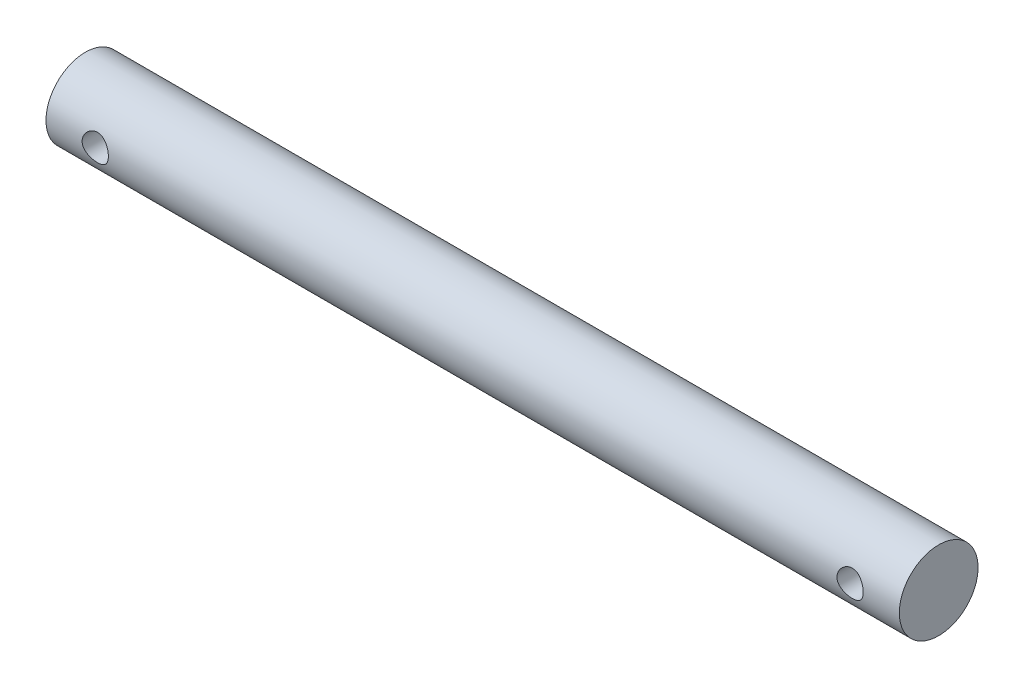
ISO-10303-21;
HEADER;
FILE_DESCRIPTION(('STEP AP214'),'2;1');
FILE_NAME('part.step','',(''),(''),'','','');
FILE_SCHEMA(('AUTOMOTIVE_DESIGN { 1 0 10303 214 1 1 1 1 }'));
ENDSEC;
DATA;
#1=APPLICATION_CONTEXT('core data for automotive mechanical design processes');
#2=APPLICATION_PROTOCOL_DEFINITION('international standard','automotive_design',2000,#1);
#3=PRODUCT_CONTEXT('',#1,'mechanical');
#4=PRODUCT('Part','Part','',(#3));
#5=PRODUCT_RELATED_PRODUCT_CATEGORY('part','',(#4));
#6=PRODUCT_DEFINITION_FORMATION('','',#4);
#7=PRODUCT_DEFINITION_CONTEXT('part definition',#1,'design');
#8=PRODUCT_DEFINITION('design','',#6,#7);
#9=PRODUCT_DEFINITION_SHAPE('','',#8);
#10=(LENGTH_UNIT() NAMED_UNIT(*) SI_UNIT(.MILLI.,.METRE.));
#11=(NAMED_UNIT(*) PLANE_ANGLE_UNIT() SI_UNIT($,.RADIAN.));
#12=(NAMED_UNIT(*) SI_UNIT($,.STERADIAN.) SOLID_ANGLE_UNIT());
#13=UNCERTAINTY_MEASURE_WITH_UNIT(LENGTH_MEASURE(1.E-05),#10,'distance_accuracy_value','');
#14=(GEOMETRIC_REPRESENTATION_CONTEXT(3) GLOBAL_UNCERTAINTY_ASSIGNED_CONTEXT((#13)) GLOBAL_UNIT_ASSIGNED_CONTEXT((#10,
#11,#12)) REPRESENTATION_CONTEXT('',''));
#15=CARTESIAN_POINT('',(0.,0.,0.));
#16=DIRECTION('',(0.,0.,1.));
#17=DIRECTION('',(1.,0.,0.));
#18=AXIS2_PLACEMENT_3D('',#15,#16,#17);
#19=CARTESIAN_POINT('',(0.,0.,0.));
#20=DIRECTION('',(1.,0.,0.));
#21=DIRECTION('',(0.,0.,-1.));
#22=AXIS2_PLACEMENT_3D('',#19,#20,#21);
#23=PLANE('',#22);
#24=CARTESIAN_POINT('',(0.,0.,0.));
#25=DIRECTION('',(-1.,0.,0.));
#26=DIRECTION('',(0.,0.,1.));
#27=AXIS2_PLACEMENT_3D('',#24,#25,#26);
#28=CIRCLE('',#27,6.);
#29=CARTESIAN_POINT('',(0.,0.,6.));
#30=VERTEX_POINT('',#29);
#31=EDGE_CURVE('E77',#30,#30,#28,.T.);
#32=ORIENTED_EDGE('',*,*,#31,.T.);
#33=EDGE_LOOP('',(#32));
#34=FACE_BOUND('',#33,.T.);
#35=ADVANCED_FACE('F30',(#34),#23,.F.);
#36=CARTESIAN_POINT('',(0.,0.,0.));
#37=DIRECTION('',(-1.,0.,0.));
#38=DIRECTION('',(0.,0.,1.));
#39=AXIS2_PLACEMENT_3D('',#36,#37,#38);
#40=CYLINDRICAL_SURFACE('',#39,6.);
#41=CARTESIAN_POINT('',(124.5,0.,-6.));
#42=CARTESIAN_POINT('',(124.500000507463,0.109126725773446,-6.00000030601888));
#43=CARTESIAN_POINT('',(124.491039467746,0.218250389077099,-5.99699539015089));
#44=CARTESIAN_POINT('',(124.455541782366,0.433283521745943,-5.98530420406561));
#45=CARTESIAN_POINT('',(124.429003312102,0.539192656237633,-5.97661734404305));
#46=CARTESIAN_POINT('',(124.359361513232,0.744665579003548,-5.95450615812885));
#47=CARTESIAN_POINT('',(124.316285875081,0.844239651772064,-5.94108975461707));
#48=CARTESIAN_POINT('',(124.214917654323,1.03474987361064,-5.91088891434684));
#49=CARTESIAN_POINT('',(124.156622069995,1.12568431391741,-5.89410381335556));
#50=CARTESIAN_POINT('',(124.024348390282,1.29948335004453,-5.8582818888601));
#51=CARTESIAN_POINT('',(123.949937531479,1.38200740059661,-5.8391911292757));
#52=CARTESIAN_POINT('',(123.788465690587,1.53366538540416,-5.80120629566243));
#53=CARTESIAN_POINT('',(123.701401930143,1.60279637097892,-5.78231226581098));
#54=CARTESIAN_POINT('',(123.514029769607,1.72764988445572,-5.74626664954547));
#55=CARTESIAN_POINT('',(123.413412520536,1.78292971644206,-5.72918078551376));
#56=CARTESIAN_POINT('',(123.203647811083,1.87563774775544,-5.69950610837202));
#57=CARTESIAN_POINT('',(123.094502965675,1.91307139477353,-5.68691592321491));
#58=CARTESIAN_POINT('',(122.874653557007,1.96774692301832,-5.66822606538755));
#59=CARTESIAN_POINT('',(122.764125583022,1.98562689654354,-5.66192191539223));
#60=CARTESIAN_POINT('',(122.541472491688,2.00268224666895,-5.65591313259015));
#61=CARTESIAN_POINT('',(122.429347878582,2.00186340320943,-5.6562064604546));
#62=CARTESIAN_POINT('',(122.212126739112,1.98203980740683,-5.66318030016361));
#63=CARTESIAN_POINT('',(122.106943194162,1.96386782633398,-5.66956831735066));
#64=CARTESIAN_POINT('',(121.901213160786,1.91121232569883,-5.68753315449102));
#65=CARTESIAN_POINT('',(121.80066722913,1.87672685318374,-5.69911059568215));
#66=CARTESIAN_POINT('',(121.605174500817,1.79187811612042,-5.72635822262498));
#67=CARTESIAN_POINT('',(121.510343949061,1.74126809741452,-5.74209131586235));
#68=CARTESIAN_POINT('',(121.330258183441,1.62577821260627,-5.77585117151453));
#69=CARTESIAN_POINT('',(121.245005746133,1.56089422472801,-5.79387859580927));
#70=CARTESIAN_POINT('',(121.081816803678,1.41469866536447,-5.83134658335482));
#71=CARTESIAN_POINT('',(121.004494610982,1.33270630015262,-5.85081178709686));
#72=CARTESIAN_POINT('',(120.864537466673,1.15667913994013,-5.88813876774073));
#73=CARTESIAN_POINT('',(120.801903923671,1.06264319132163,-5.90600039076135));
#74=CARTESIAN_POINT('',(120.69260739953,0.863895226092534,-5.93834215875587));
#75=CARTESIAN_POINT('',(120.646109017319,0.759086552832672,-5.95278700016078));
#76=CARTESIAN_POINT('',(120.571593652089,0.542538166729012,-5.9764113428887));
#77=CARTESIAN_POINT('',(120.543570249153,0.430800876309905,-5.98559267309759));
#78=CARTESIAN_POINT('',(120.507888667955,0.208767659058606,-5.99735254142881));
#79=CARTESIAN_POINT('',(120.499400381655,0.0986191997296909,-6.00020003667456));
#80=CARTESIAN_POINT('',(120.500665347197,-0.121550139920476,-5.99977805389655));
#81=CARTESIAN_POINT('',(120.51041551996,-0.231571038639301,-5.99650960838725));
#82=CARTESIAN_POINT('',(120.547223815472,-0.445039732608511,-5.98440049434209));
#83=CARTESIAN_POINT('',(120.573772412099,-0.548585613669687,-5.97572397422385));
#84=CARTESIAN_POINT('',(120.642786888933,-0.749711917159147,-5.9538369366014));
#85=CARTESIAN_POINT('',(120.685254798936,-0.847291577017213,-5.9406258409335));
#86=CARTESIAN_POINT('',(120.786140863682,-1.03657659278655,-5.91057862574579));
#87=CARTESIAN_POINT('',(120.844949186566,-1.12805991843429,-5.89365629511572));
#88=CARTESIAN_POINT('',(120.976388300027,-1.30012966027117,-5.85810507832525));
#89=CARTESIAN_POINT('',(121.049023312064,-1.38071273559115,-5.83947567187655));
#90=CARTESIAN_POINT('',(121.209957502013,-1.5325050156126,-5.80153695960889));
#91=CARTESIAN_POINT('',(121.298818453854,-1.60312193849153,-5.78223522174856));
#92=CARTESIAN_POINT('',(121.487543135622,-1.72851504464714,-5.74599946589418));
#93=CARTESIAN_POINT('',(121.587406957268,-1.78329109586202,-5.72906546764005));
#94=CARTESIAN_POINT('',(121.79534603058,-1.87519386083272,-5.69964783582767));
#95=CARTESIAN_POINT('',(121.903404158338,-1.91235626433004,-5.68715521585958));
#96=CARTESIAN_POINT('',(122.124757300088,-1.96778933351871,-5.66821664612899));
#97=CARTESIAN_POINT('',(122.238049930809,-1.98606850990788,-5.66176797247279));
#98=CARTESIAN_POINT('',(122.460394192082,-2.00255256495468,-5.65595717748355));
#99=CARTESIAN_POINT('',(122.569364680574,-2.0017405146168,-5.6562480051483));
#100=CARTESIAN_POINT('',(122.785530149844,-1.98248458689738,-5.66302539647735));
#101=CARTESIAN_POINT('',(122.89272523591,-1.96404175891717,-5.66951159138723));
#102=CARTESIAN_POINT('',(123.100271326005,-1.91074362625869,-5.68769048609783));
#103=CARTESIAN_POINT('',(123.200713650009,-1.87620669203103,-5.69928196044955));
#104=CARTESIAN_POINT('',(123.394454813877,-1.79195873151949,-5.72632797636937));
#105=CARTESIAN_POINT('',(123.487752062376,-1.74224433710761,-5.74178337526786));
#106=CARTESIAN_POINT('',(123.668967339846,-1.62652138516685,-5.77565658452093));
#107=CARTESIAN_POINT('',(123.756473003797,-1.55989648552915,-5.79417423284274));
#108=CARTESIAN_POINT('',(123.919379626768,-1.41328576627129,-5.83166712566506));
#109=CARTESIAN_POINT('',(123.994777151376,-1.33329616890295,-5.85064249824745));
#110=CARTESIAN_POINT('',(124.134288824578,-1.15848311384137,-5.88780061051088));
#111=CARTESIAN_POINT('',(124.197848695502,-1.06320302699945,-5.90592363602513));
#112=CARTESIAN_POINT('',(124.307980857701,-0.862714714813246,-5.93851982345224));
#113=CARTESIAN_POINT('',(124.354557491844,-0.757509036264692,-5.9529939181586));
#114=CARTESIAN_POINT('',(124.427443264977,-0.544987294401945,-5.97611030137084));
#115=CARTESIAN_POINT('',(124.454564932527,-0.437975515352811,-5.98498424845045));
#116=CARTESIAN_POINT('',(124.490840561354,-0.22064083202049,-5.99692814128444));
#117=CARTESIAN_POINT('',(124.499999486993,-0.110318851137491,-5.9999996906381));
#118=CARTESIAN_POINT('',(124.5,0.,-6.));
#119=B_SPLINE_CURVE_WITH_KNOTS('',3,(#41,#42,#43,#44,#45,#46,#47,#48,#49,#50,#51,#52,#53,#54,
#55,#56,#57,#58,#59,#60,#61,#62,#63,#64,#65,#66,#67,#68,#69,#70,#71,#72,#73,#74,#75,#76,#77,#78,
#79,#80,#81,#82,#83,#84,#85,#86,#87,#88,#89,#90,#91,#92,#93,#94,#95,#96,#97,#98,#99,#100,#101,
#102,#103,#104,#105,#106,#107,#108,#109,#110,#111,#112,#113,#114,#115,#116,#117,#118),
.UNSPECIFIED.,.T.,.F.,(4,2,2,2,2,2,2,2,2,2,2,2,2,2,2,2,2,2,2,2,2,2,2,2,2,2,2,2,2,2,2,2,2,2,2,2,
2,2,4),(0.,0.326974212052021,0.653982370535041,0.980445345740539,1.30697275559819,
1.64369368565512,1.98048866575061,2.32696769646942,2.67334089385666,3.00803851483681,
3.34263267974972,3.66193653102562,3.98127861710962,4.30576342310261,4.63034205116415,
4.97186611622733,5.31342291933235,5.65836811300715,6.00319337754416,6.33307166350338,
6.66289426328352,6.98316315956426,7.30347290568206,7.63220799687472,7.96104361643781,
8.30482045761502,8.64860016469991,8.99168027653541,9.33460569411678,9.65991332128513,
9.98520158702748,10.3043117416083,10.6234927635195,10.9566013338361,11.2898042224756,
11.635993216702,11.9820936230491,12.3127311674763,12.6432773207628),.UNSPECIFIED.);
#120=CARTESIAN_POINT('',(124.5,0.,-6.));
#121=VERTEX_POINT('',#120);
#122=EDGE_CURVE('E10',#121,#121,#119,.T.);
#123=ORIENTED_EDGE('',*,*,#122,.T.);
#124=EDGE_LOOP('',(#123));
#125=FACE_BOUND('',#124,.T.);
#126=CARTESIAN_POINT('',(124.5,0.,6.));
#127=CARTESIAN_POINT('',(124.500000507463,-0.109126725773446,6.00000030601888));
#128=CARTESIAN_POINT('',(124.491039467746,-0.218250389077099,5.99699539015089));
#129=CARTESIAN_POINT('',(124.455541782366,-0.433283521745943,5.98530420406561));
#130=CARTESIAN_POINT('',(124.429003312102,-0.539192656237633,5.97661734404305));
#131=CARTESIAN_POINT('',(124.359361513232,-0.744665579003548,5.95450615812885));
#132=CARTESIAN_POINT('',(124.316285875081,-0.844239651772064,5.94108975461707));
#133=CARTESIAN_POINT('',(124.214917654323,-1.03474987361064,5.91088891434684));
#134=CARTESIAN_POINT('',(124.156622069995,-1.12568431391741,5.89410381335556));
#135=CARTESIAN_POINT('',(124.024348390282,-1.29948335004453,5.8582818888601));
#136=CARTESIAN_POINT('',(123.949937531479,-1.38200740059661,5.8391911292757));
#137=CARTESIAN_POINT('',(123.788465690587,-1.53366538540416,5.80120629566243));
#138=CARTESIAN_POINT('',(123.701401930143,-1.60279637097892,5.78231226581098));
#139=CARTESIAN_POINT('',(123.514029769607,-1.72764988445572,5.74626664954547));
#140=CARTESIAN_POINT('',(123.413412520536,-1.78292971644206,5.72918078551376));
#141=CARTESIAN_POINT('',(123.203647811083,-1.87563774775544,5.69950610837202));
#142=CARTESIAN_POINT('',(123.094502965675,-1.91307139477353,5.68691592321491));
#143=CARTESIAN_POINT('',(122.874653557007,-1.96774692301832,5.66822606538755));
#144=CARTESIAN_POINT('',(122.764125583022,-1.98562689654354,5.66192191539223));
#145=CARTESIAN_POINT('',(122.541472491688,-2.00268224666895,5.65591313259015));
#146=CARTESIAN_POINT('',(122.429347878582,-2.00186340320943,5.6562064604546));
#147=CARTESIAN_POINT('',(122.212126739112,-1.98203980740683,5.66318030016361));
#148=CARTESIAN_POINT('',(122.106943194162,-1.96386782633398,5.66956831735066));
#149=CARTESIAN_POINT('',(121.901213160786,-1.91121232569883,5.68753315449102));
#150=CARTESIAN_POINT('',(121.80066722913,-1.87672685318374,5.69911059568215));
#151=CARTESIAN_POINT('',(121.605174500817,-1.79187811612042,5.72635822262498));
#152=CARTESIAN_POINT('',(121.510343949061,-1.74126809741452,5.74209131586235));
#153=CARTESIAN_POINT('',(121.330258183441,-1.62577821260627,5.77585117151453));
#154=CARTESIAN_POINT('',(121.245005746133,-1.56089422472801,5.79387859580927));
#155=CARTESIAN_POINT('',(121.081816803678,-1.41469866536447,5.83134658335482));
#156=CARTESIAN_POINT('',(121.004494610982,-1.33270630015262,5.85081178709686));
#157=CARTESIAN_POINT('',(120.864537466673,-1.15667913994013,5.88813876774073));
#158=CARTESIAN_POINT('',(120.801903923671,-1.06264319132163,5.90600039076135));
#159=CARTESIAN_POINT('',(120.69260739953,-0.863895226092534,5.93834215875587));
#160=CARTESIAN_POINT('',(120.646109017319,-0.759086552832672,5.95278700016078));
#161=CARTESIAN_POINT('',(120.571593652089,-0.542538166729012,5.9764113428887));
#162=CARTESIAN_POINT('',(120.543570249153,-0.430800876309905,5.98559267309759));
#163=CARTESIAN_POINT('',(120.507888667955,-0.208767659058606,5.99735254142881));
#164=CARTESIAN_POINT('',(120.499400381655,-0.0986191997296909,6.00020003667456));
#165=CARTESIAN_POINT('',(120.500665347197,0.121550139920476,5.99977805389655));
#166=CARTESIAN_POINT('',(120.51041551996,0.231571038639301,5.99650960838725));
#167=CARTESIAN_POINT('',(120.547223815472,0.445039732608511,5.98440049434209));
#168=CARTESIAN_POINT('',(120.573772412099,0.548585613669687,5.97572397422385));
#169=CARTESIAN_POINT('',(120.642786888933,0.749711917159147,5.9538369366014));
#170=CARTESIAN_POINT('',(120.685254798936,0.847291577017213,5.9406258409335));
#171=CARTESIAN_POINT('',(120.786140863682,1.03657659278655,5.91057862574579));
#172=CARTESIAN_POINT('',(120.844949186566,1.12805991843429,5.89365629511572));
#173=CARTESIAN_POINT('',(120.976388300027,1.30012966027117,5.85810507832525));
#174=CARTESIAN_POINT('',(121.049023312064,1.38071273559115,5.83947567187655));
#175=CARTESIAN_POINT('',(121.209957502013,1.5325050156126,5.80153695960889));
#176=CARTESIAN_POINT('',(121.298818453854,1.60312193849153,5.78223522174856));
#177=CARTESIAN_POINT('',(121.487543135622,1.72851504464714,5.74599946589418));
#178=CARTESIAN_POINT('',(121.587406957268,1.78329109586202,5.72906546764005));
#179=CARTESIAN_POINT('',(121.79534603058,1.87519386083272,5.69964783582767));
#180=CARTESIAN_POINT('',(121.903404158338,1.91235626433004,5.68715521585958));
#181=CARTESIAN_POINT('',(122.124757300088,1.96778933351871,5.66821664612899));
#182=CARTESIAN_POINT('',(122.238049930809,1.98606850990788,5.66176797247279));
#183=CARTESIAN_POINT('',(122.460394192082,2.00255256495468,5.65595717748355));
#184=CARTESIAN_POINT('',(122.569364680574,2.0017405146168,5.6562480051483));
#185=CARTESIAN_POINT('',(122.785530149844,1.98248458689738,5.66302539647735));
#186=CARTESIAN_POINT('',(122.89272523591,1.96404175891717,5.66951159138723));
#187=CARTESIAN_POINT('',(123.100271326005,1.91074362625869,5.68769048609783));
#188=CARTESIAN_POINT('',(123.200713650009,1.87620669203103,5.69928196044955));
#189=CARTESIAN_POINT('',(123.394454813877,1.79195873151949,5.72632797636937));
#190=CARTESIAN_POINT('',(123.487752062376,1.74224433710761,5.74178337526786));
#191=CARTESIAN_POINT('',(123.668967339846,1.62652138516685,5.77565658452093));
#192=CARTESIAN_POINT('',(123.756473003797,1.55989648552915,5.79417423284274));
#193=CARTESIAN_POINT('',(123.919379626768,1.41328576627129,5.83166712566506));
#194=CARTESIAN_POINT('',(123.994777151376,1.33329616890295,5.85064249824745));
#195=CARTESIAN_POINT('',(124.134288824578,1.15848311384137,5.88780061051088));
#196=CARTESIAN_POINT('',(124.197848695502,1.06320302699945,5.90592363602513));
#197=CARTESIAN_POINT('',(124.307980857701,0.862714714813246,5.93851982345224));
#198=CARTESIAN_POINT('',(124.354557491844,0.757509036264692,5.9529939181586));
#199=CARTESIAN_POINT('',(124.427443264977,0.544987294401945,5.97611030137084));
#200=CARTESIAN_POINT('',(124.454564932527,0.437975515352811,5.98498424845045));
#201=CARTESIAN_POINT('',(124.490840561354,0.22064083202049,5.99692814128444));
#202=CARTESIAN_POINT('',(124.499999486993,0.110318851137491,5.9999996906381));
#203=CARTESIAN_POINT('',(124.5,0.,6.));
#204=B_SPLINE_CURVE_WITH_KNOTS('',3,(#126,#127,#128,#129,#130,#131,#132,#133,#134,#135,#136,
#137,#138,#139,#140,#141,#142,#143,#144,#145,#146,#147,#148,#149,#150,#151,#152,#153,#154,#155,
#156,#157,#158,#159,#160,#161,#162,#163,#164,#165,#166,#167,#168,#169,#170,#171,#172,#173,#174,
#175,#176,#177,#178,#179,#180,#181,#182,#183,#184,#185,#186,#187,#188,#189,#190,#191,#192,#193,
#194,#195,#196,#197,#198,#199,#200,#201,#202,#203),.UNSPECIFIED.,.T.,.F.,(4,2,2,2,2,2,2,2,2,2,2,
2,2,2,2,2,2,2,2,2,2,2,2,2,2,2,2,2,2,2,2,2,2,2,2,2,2,2,4),(0.,0.326974212052021,
0.653982370535041,0.980445345740539,1.30697275559819,1.64369368565512,1.98048866575061,
2.32696769646942,2.67334089385666,3.00803851483681,3.34263267974972,3.66193653102562,
3.98127861710962,4.30576342310261,4.63034205116415,4.97186611622733,5.31342291933235,
5.65836811300715,6.00319337754416,6.33307166350338,6.66289426328352,6.98316315956426,
7.30347290568206,7.63220799687472,7.96104361643781,8.30482045761502,8.64860016469991,
8.99168027653541,9.33460569411678,9.65991332128513,9.98520158702748,10.3043117416083,
10.6234927635195,10.9566013338361,11.2898042224756,11.635993216702,11.9820936230491,
12.3127311674763,12.6432773207628),.UNSPECIFIED.);
#205=CARTESIAN_POINT('',(124.5,0.,6.));
#206=VERTEX_POINT('',#205);
#207=EDGE_CURVE('E40',#206,#206,#204,.T.);
#208=ORIENTED_EDGE('',*,*,#207,.T.);
#209=EDGE_LOOP('',(#208));
#210=FACE_BOUND('',#209,.T.);
#211=CARTESIAN_POINT('',(9.5,0.,-6.));
#212=CARTESIAN_POINT('',(9.50000050746328,0.109126725773446,-6.00000030601888));
#213=CARTESIAN_POINT('',(9.49103946774557,0.2182503890771,-5.99699539015089));
#214=CARTESIAN_POINT('',(9.45554178236556,0.433283521745945,-5.98530420406561));
#215=CARTESIAN_POINT('',(9.42900331210215,0.539192656237635,-5.97661734404305));
#216=CARTESIAN_POINT('',(9.3593615132319,0.744665579003552,-5.95450615812885));
#217=CARTESIAN_POINT('',(9.31628587508146,0.844239651772069,-5.94108975461707));
#218=CARTESIAN_POINT('',(9.2149176543233,1.03474987361065,-5.91088891434684));
#219=CARTESIAN_POINT('',(9.1566220699948,1.12568431391741,-5.89410381335556));
#220=CARTESIAN_POINT('',(9.02434839028249,1.29948335004453,-5.8582818888601));
#221=CARTESIAN_POINT('',(8.94993753147901,1.38200740059662,-5.8391911292757));
#222=CARTESIAN_POINT('',(8.78846569058687,1.53366538540417,-5.80120629566243));
#223=CARTESIAN_POINT('',(8.70140193014297,1.60279637097892,-5.78231226581098));
#224=CARTESIAN_POINT('',(8.51402976960708,1.72764988445572,-5.74626664954548));
#225=CARTESIAN_POINT('',(8.41341252053576,1.78292971644206,-5.72918078551376));
#226=CARTESIAN_POINT('',(8.20364781108291,1.87563774775544,-5.69950610837202));
#227=CARTESIAN_POINT('',(8.09450296567451,1.91307139477353,-5.68691592321491));
#228=CARTESIAN_POINT('',(7.87465355700658,1.96774692301833,-5.66822606538754));
#229=CARTESIAN_POINT('',(7.76412558302187,1.98562689654354,-5.66192191539223));
#230=CARTESIAN_POINT('',(7.54147249168824,2.00268224666895,-5.65591313259015));
#231=CARTESIAN_POINT('',(7.42934787858162,2.00186340320944,-5.6562064604546));
#232=CARTESIAN_POINT('',(7.21212673911196,1.98203980740684,-5.6631803001636));
#233=CARTESIAN_POINT('',(7.10694319416196,1.96386782633399,-5.66956831735066));
#234=CARTESIAN_POINT('',(6.90121316078633,1.91121232569883,-5.68753315449102));
#235=CARTESIAN_POINT('',(6.80066722912986,1.87672685318374,-5.69911059568215));
#236=CARTESIAN_POINT('',(6.60517450081704,1.79187811612042,-5.72635822262498));
#237=CARTESIAN_POINT('',(6.51034394906095,1.74126809741452,-5.74209131586235));
#238=CARTESIAN_POINT('',(6.33025818344055,1.62577821260628,-5.77585117151453));
#239=CARTESIAN_POINT('',(6.24500574613324,1.56089422472801,-5.79387859580927));
#240=CARTESIAN_POINT('',(6.08181680367846,1.41469866536447,-5.83134658335482));
#241=CARTESIAN_POINT('',(6.00449461098186,1.33270630015262,-5.85081178709686));
#242=CARTESIAN_POINT('',(5.8645374666732,1.15667913994013,-5.88813876774073));
#243=CARTESIAN_POINT('',(5.80190392367101,1.06264319132163,-5.90600039076135));
#244=CARTESIAN_POINT('',(5.69260739952986,0.863895226092535,-5.93834215875587));
#245=CARTESIAN_POINT('',(5.64610901731854,0.759086552832673,-5.95278700016078));
#246=CARTESIAN_POINT('',(5.57159365208858,0.542538166729015,-5.9764113428887));
#247=CARTESIAN_POINT('',(5.54357024915313,0.430800876309907,-5.98559267309759));
#248=CARTESIAN_POINT('',(5.50788866795528,0.208767659058608,-5.99735254142881));
#249=CARTESIAN_POINT('',(5.4994003816545,0.0986191997296923,-6.00020003667456));
#250=CARTESIAN_POINT('',(5.50066534719694,-0.121550139920475,-5.99977805389655));
#251=CARTESIAN_POINT('',(5.51041551995975,-0.231571038639301,-5.99650960838725));
#252=CARTESIAN_POINT('',(5.54722381547192,-0.445039732608511,-5.98440049434209));
#253=CARTESIAN_POINT('',(5.57377241209899,-0.548585613669687,-5.97572397422385));
#254=CARTESIAN_POINT('',(5.64278688893346,-0.749711917159147,-5.9538369366014));
#255=CARTESIAN_POINT('',(5.68525479893557,-0.847291577017213,-5.9406258409335));
#256=CARTESIAN_POINT('',(5.78614086368157,-1.03657659278655,-5.91057862574579));
#257=CARTESIAN_POINT('',(5.84494918656634,-1.12805991843429,-5.89365629511572));
#258=CARTESIAN_POINT('',(5.97638830002697,-1.30012966027117,-5.85810507832525));
#259=CARTESIAN_POINT('',(6.04902331206353,-1.38071273559115,-5.83947567187655));
#260=CARTESIAN_POINT('',(6.20995750201318,-1.5325050156126,-5.8015369596089));
#261=CARTESIAN_POINT('',(6.29881845385372,-1.60312193849154,-5.78223522174856));
#262=CARTESIAN_POINT('',(6.48754313562178,-1.72851504464715,-5.74599946589417));
#263=CARTESIAN_POINT('',(6.58740695726815,-1.78329109586203,-5.72906546764005));
#264=CARTESIAN_POINT('',(6.79534603057979,-1.87519386083272,-5.69964783582767));
#265=CARTESIAN_POINT('',(6.90340415833753,-1.91235626433004,-5.68715521585958));
#266=CARTESIAN_POINT('',(7.12475730008826,-1.96778933351871,-5.66821664612899));
#267=CARTESIAN_POINT('',(7.2380499308087,-1.98606850990788,-5.66176797247279));
#268=CARTESIAN_POINT('',(7.46039419208183,-2.00255256495468,-5.65595717748354));
#269=CARTESIAN_POINT('',(7.56936468057365,-2.0017405146168,-5.6562480051483));
#270=CARTESIAN_POINT('',(7.78553014984413,-1.98248458689739,-5.66302539647735));
#271=CARTESIAN_POINT('',(7.89272523591018,-1.96404175891717,-5.66951159138723));
#272=CARTESIAN_POINT('',(8.10027132600495,-1.91074362625869,-5.68769048609783));
#273=CARTESIAN_POINT('',(8.20071365000899,-1.87620669203103,-5.69928196044955));
#274=CARTESIAN_POINT('',(8.39445481387654,-1.79195873151949,-5.72632797636937));
#275=CARTESIAN_POINT('',(8.48775206237601,-1.74224433710761,-5.74178337526786));
#276=CARTESIAN_POINT('',(8.66896733984582,-1.62652138516686,-5.77565658452093));
#277=CARTESIAN_POINT('',(8.75647300379677,-1.55989648552916,-5.79417423284274));
#278=CARTESIAN_POINT('',(8.9193796267684,-1.4132857662713,-5.83166712566506));
#279=CARTESIAN_POINT('',(8.99477715137615,-1.33329616890296,-5.85064249824745));
#280=CARTESIAN_POINT('',(9.13428882457836,-1.15848311384138,-5.88780061051088));
#281=CARTESIAN_POINT('',(9.197848695502,-1.06320302699946,-5.90592363602513));
#282=CARTESIAN_POINT('',(9.30798085770129,-0.862714714813249,-5.93851982345224));
#283=CARTESIAN_POINT('',(9.35455749184408,-0.757509036264696,-5.9529939181586));
#284=CARTESIAN_POINT('',(9.42744326497734,-0.54498729440195,-5.97611030137084));
#285=CARTESIAN_POINT('',(9.45456493252675,-0.437975515352816,-5.98498424845045));
#286=CARTESIAN_POINT('',(9.49084056135425,-0.220640832020493,-5.99692814128444));
#287=CARTESIAN_POINT('',(9.49999948699307,-0.110318851137492,-5.9999996906381));
#288=CARTESIAN_POINT('',(9.5,0.,-6.));
#289=B_SPLINE_CURVE_WITH_KNOTS('',3,(#211,#212,#213,#214,#215,#216,#217,#218,#219,#220,#221,
#222,#223,#224,#225,#226,#227,#228,#229,#230,#231,#232,#233,#234,#235,#236,#237,#238,#239,#240,
#241,#242,#243,#244,#245,#246,#247,#248,#249,#250,#251,#252,#253,#254,#255,#256,#257,#258,#259,
#260,#261,#262,#263,#264,#265,#266,#267,#268,#269,#270,#271,#272,#273,#274,#275,#276,#277,#278,
#279,#280,#281,#282,#283,#284,#285,#286,#287,#288),.UNSPECIFIED.,.T.,.F.,(4,2,2,2,2,2,2,2,2,2,2,
2,2,2,2,2,2,2,2,2,2,2,2,2,2,2,2,2,2,2,2,2,2,2,2,2,2,2,4),(0.,0.326974212052022,
0.653982370535042,0.980445345740548,1.3069727555982,1.64369368565512,1.9804886657506,
2.32696769646941,2.67334089385667,3.0080385148368,3.34263267974971,3.6619365310256,
3.98127861710964,4.30576342310261,4.63034205116414,4.97186611622734,5.31342291933236,
5.65836811300715,6.00319337754416,6.33307166350339,6.66289426328353,6.98316315956427,
7.30347290568207,7.63220799687473,7.96104361643782,8.30482045761503,8.64860016469993,
8.99168027653541,9.3346056941168,9.65991332128516,9.9852015870275,10.3043117416083,
10.6234927635195,10.9566013338361,11.2898042224756,11.635993216702,11.9820936230491,
12.3127311674763,12.6432773207628),.UNSPECIFIED.);
#290=CARTESIAN_POINT('',(9.5,0.,-6.));
#291=VERTEX_POINT('',#290);
#292=EDGE_CURVE('E44',#291,#291,#289,.T.);
#293=ORIENTED_EDGE('',*,*,#292,.T.);
#294=EDGE_LOOP('',(#293));
#295=FACE_BOUND('',#294,.T.);
#296=CARTESIAN_POINT('',(9.5,0.,6.));
#297=CARTESIAN_POINT('',(9.50000050746328,-0.109126725773446,6.00000030601888));
#298=CARTESIAN_POINT('',(9.49103946774557,-0.2182503890771,5.99699539015089));
#299=CARTESIAN_POINT('',(9.45554178236556,-0.433283521745945,5.98530420406561));
#300=CARTESIAN_POINT('',(9.42900331210215,-0.539192656237635,5.97661734404305));
#301=CARTESIAN_POINT('',(9.3593615132319,-0.744665579003552,5.95450615812885));
#302=CARTESIAN_POINT('',(9.31628587508146,-0.844239651772069,5.94108975461707));
#303=CARTESIAN_POINT('',(9.2149176543233,-1.03474987361065,5.91088891434684));
#304=CARTESIAN_POINT('',(9.1566220699948,-1.12568431391741,5.89410381335556));
#305=CARTESIAN_POINT('',(9.02434839028249,-1.29948335004453,5.8582818888601));
#306=CARTESIAN_POINT('',(8.94993753147901,-1.38200740059662,5.8391911292757));
#307=CARTESIAN_POINT('',(8.78846569058687,-1.53366538540417,5.80120629566243));
#308=CARTESIAN_POINT('',(8.70140193014297,-1.60279637097892,5.78231226581098));
#309=CARTESIAN_POINT('',(8.51402976960708,-1.72764988445572,5.74626664954548));
#310=CARTESIAN_POINT('',(8.41341252053576,-1.78292971644206,5.72918078551376));
#311=CARTESIAN_POINT('',(8.20364781108291,-1.87563774775544,5.69950610837202));
#312=CARTESIAN_POINT('',(8.09450296567451,-1.91307139477353,5.68691592321491));
#313=CARTESIAN_POINT('',(7.87465355700658,-1.96774692301833,5.66822606538754));
#314=CARTESIAN_POINT('',(7.76412558302187,-1.98562689654354,5.66192191539223));
#315=CARTESIAN_POINT('',(7.54147249168824,-2.00268224666895,5.65591313259015));
#316=CARTESIAN_POINT('',(7.42934787858162,-2.00186340320944,5.6562064604546));
#317=CARTESIAN_POINT('',(7.21212673911196,-1.98203980740684,5.6631803001636));
#318=CARTESIAN_POINT('',(7.10694319416196,-1.96386782633399,5.66956831735066));
#319=CARTESIAN_POINT('',(6.90121316078633,-1.91121232569883,5.68753315449102));
#320=CARTESIAN_POINT('',(6.80066722912986,-1.87672685318374,5.69911059568215));
#321=CARTESIAN_POINT('',(6.60517450081704,-1.79187811612042,5.72635822262498));
#322=CARTESIAN_POINT('',(6.51034394906095,-1.74126809741452,5.74209131586235));
#323=CARTESIAN_POINT('',(6.33025818344055,-1.62577821260628,5.77585117151453));
#324=CARTESIAN_POINT('',(6.24500574613324,-1.56089422472801,5.79387859580927));
#325=CARTESIAN_POINT('',(6.08181680367846,-1.41469866536447,5.83134658335482));
#326=CARTESIAN_POINT('',(6.00449461098186,-1.33270630015262,5.85081178709686));
#327=CARTESIAN_POINT('',(5.8645374666732,-1.15667913994013,5.88813876774073));
#328=CARTESIAN_POINT('',(5.80190392367101,-1.06264319132163,5.90600039076135));
#329=CARTESIAN_POINT('',(5.69260739952986,-0.863895226092535,5.93834215875587));
#330=CARTESIAN_POINT('',(5.64610901731854,-0.759086552832673,5.95278700016078));
#331=CARTESIAN_POINT('',(5.57159365208858,-0.542538166729015,5.9764113428887));
#332=CARTESIAN_POINT('',(5.54357024915313,-0.430800876309907,5.98559267309759));
#333=CARTESIAN_POINT('',(5.50788866795528,-0.208767659058608,5.99735254142881));
#334=CARTESIAN_POINT('',(5.4994003816545,-0.0986191997296923,6.00020003667456));
#335=CARTESIAN_POINT('',(5.50066534719694,0.121550139920475,5.99977805389655));
#336=CARTESIAN_POINT('',(5.51041551995975,0.231571038639301,5.99650960838725));
#337=CARTESIAN_POINT('',(5.54722381547192,0.445039732608511,5.98440049434209));
#338=CARTESIAN_POINT('',(5.57377241209899,0.548585613669687,5.97572397422385));
#339=CARTESIAN_POINT('',(5.64278688893346,0.749711917159147,5.9538369366014));
#340=CARTESIAN_POINT('',(5.68525479893557,0.847291577017213,5.9406258409335));
#341=CARTESIAN_POINT('',(5.78614086368157,1.03657659278655,5.91057862574579));
#342=CARTESIAN_POINT('',(5.84494918656634,1.12805991843429,5.89365629511572));
#343=CARTESIAN_POINT('',(5.97638830002697,1.30012966027117,5.85810507832525));
#344=CARTESIAN_POINT('',(6.04902331206353,1.38071273559115,5.83947567187655));
#345=CARTESIAN_POINT('',(6.20995750201318,1.5325050156126,5.8015369596089));
#346=CARTESIAN_POINT('',(6.29881845385372,1.60312193849154,5.78223522174856));
#347=CARTESIAN_POINT('',(6.48754313562178,1.72851504464715,5.74599946589417));
#348=CARTESIAN_POINT('',(6.58740695726815,1.78329109586203,5.72906546764005));
#349=CARTESIAN_POINT('',(6.79534603057979,1.87519386083272,5.69964783582767));
#350=CARTESIAN_POINT('',(6.90340415833753,1.91235626433004,5.68715521585958));
#351=CARTESIAN_POINT('',(7.12475730008826,1.96778933351871,5.66821664612899));
#352=CARTESIAN_POINT('',(7.2380499308087,1.98606850990788,5.66176797247279));
#353=CARTESIAN_POINT('',(7.46039419208183,2.00255256495468,5.65595717748354));
#354=CARTESIAN_POINT('',(7.56936468057365,2.0017405146168,5.6562480051483));
#355=CARTESIAN_POINT('',(7.78553014984413,1.98248458689739,5.66302539647735));
#356=CARTESIAN_POINT('',(7.89272523591018,1.96404175891717,5.66951159138723));
#357=CARTESIAN_POINT('',(8.10027132600495,1.91074362625869,5.68769048609783));
#358=CARTESIAN_POINT('',(8.20071365000899,1.87620669203103,5.69928196044955));
#359=CARTESIAN_POINT('',(8.39445481387654,1.79195873151949,5.72632797636937));
#360=CARTESIAN_POINT('',(8.48775206237601,1.74224433710761,5.74178337526786));
#361=CARTESIAN_POINT('',(8.66896733984582,1.62652138516686,5.77565658452093));
#362=CARTESIAN_POINT('',(8.75647300379677,1.55989648552916,5.79417423284274));
#363=CARTESIAN_POINT('',(8.9193796267684,1.4132857662713,5.83166712566506));
#364=CARTESIAN_POINT('',(8.99477715137615,1.33329616890296,5.85064249824745));
#365=CARTESIAN_POINT('',(9.13428882457836,1.15848311384138,5.88780061051088));
#366=CARTESIAN_POINT('',(9.197848695502,1.06320302699946,5.90592363602513));
#367=CARTESIAN_POINT('',(9.30798085770129,0.862714714813249,5.93851982345224));
#368=CARTESIAN_POINT('',(9.35455749184408,0.757509036264696,5.9529939181586));
#369=CARTESIAN_POINT('',(9.42744326497734,0.54498729440195,5.97611030137084));
#370=CARTESIAN_POINT('',(9.45456493252675,0.437975515352816,5.98498424845045));
#371=CARTESIAN_POINT('',(9.49084056135425,0.220640832020493,5.99692814128444));
#372=CARTESIAN_POINT('',(9.49999948699307,0.110318851137492,5.9999996906381));
#373=CARTESIAN_POINT('',(9.5,0.,6.));
#374=B_SPLINE_CURVE_WITH_KNOTS('',3,(#296,#297,#298,#299,#300,#301,#302,#303,#304,#305,#306,
#307,#308,#309,#310,#311,#312,#313,#314,#315,#316,#317,#318,#319,#320,#321,#322,#323,#324,#325,
#326,#327,#328,#329,#330,#331,#332,#333,#334,#335,#336,#337,#338,#339,#340,#341,#342,#343,#344,
#345,#346,#347,#348,#349,#350,#351,#352,#353,#354,#355,#356,#357,#358,#359,#360,#361,#362,#363,
#364,#365,#366,#367,#368,#369,#370,#371,#372,#373),.UNSPECIFIED.,.T.,.F.,(4,2,2,2,2,2,2,2,2,2,2,
2,2,2,2,2,2,2,2,2,2,2,2,2,2,2,2,2,2,2,2,2,2,2,2,2,2,2,4),(0.,0.326974212052022,
0.653982370535042,0.980445345740548,1.3069727555982,1.64369368565512,1.9804886657506,
2.32696769646941,2.67334089385667,3.0080385148368,3.34263267974971,3.6619365310256,
3.98127861710964,4.30576342310261,4.63034205116414,4.97186611622734,5.31342291933236,
5.65836811300715,6.00319337754416,6.33307166350339,6.66289426328353,6.98316315956427,
7.30347290568207,7.63220799687473,7.96104361643782,8.30482045761503,8.64860016469993,
8.99168027653541,9.3346056941168,9.65991332128516,9.9852015870275,10.3043117416083,
10.6234927635195,10.9566013338361,11.2898042224756,11.635993216702,11.9820936230491,
12.3127311674763,12.6432773207628),.UNSPECIFIED.);
#375=CARTESIAN_POINT('',(9.5,0.,6.));
#376=VERTEX_POINT('',#375);
#377=EDGE_CURVE('E48',#376,#376,#374,.T.);
#378=ORIENTED_EDGE('',*,*,#377,.T.);
#379=EDGE_LOOP('',(#378));
#380=FACE_BOUND('',#379,.T.);
#381=ORIENTED_EDGE('',*,*,#31,.F.);
#382=EDGE_LOOP('',(#381));
#383=FACE_BOUND('',#382,.T.);
#384=CARTESIAN_POINT('',(130.,0.,0.));
#385=DIRECTION('',(-1.,0.,0.));
#386=DIRECTION('',(0.,0.,1.));
#387=AXIS2_PLACEMENT_3D('',#384,#385,#386);
#388=CIRCLE('',#387,6.);
#389=CARTESIAN_POINT('',(130.,0.,6.));
#390=VERTEX_POINT('',#389);
#391=EDGE_CURVE('E80',#390,#390,#388,.T.);
#392=ORIENTED_EDGE('',*,*,#391,.T.);
#393=EDGE_LOOP('',(#392));
#394=FACE_BOUND('',#393,.T.);
#395=ADVANCED_FACE('F58',(#125,#210,#295,#380,#383,#394),#40,.T.);
#396=CARTESIAN_POINT('',(130.,6.,0.));
#397=DIRECTION('',(-1.,0.,0.));
#398=DIRECTION('',(0.,0.,1.));
#399=AXIS2_PLACEMENT_3D('',#396,#397,#398);
#400=PLANE('',#399);
#401=ORIENTED_EDGE('',*,*,#391,.F.);
#402=EDGE_LOOP('',(#401));
#403=FACE_BOUND('',#402,.T.);
#404=ADVANCED_FACE('F69',(#403),#400,.F.);
#405=CARTESIAN_POINT('',(7.5,0.,-6.));
#406=DIRECTION('',(0.,0.,1.));
#407=DIRECTION('',(1.,0.,0.));
#408=AXIS2_PLACEMENT_3D('',#405,#406,#407);
#409=CYLINDRICAL_SURFACE('',#408,2.);
#410=ORIENTED_EDGE('',*,*,#377,.F.);
#411=EDGE_LOOP('',(#410));
#412=FACE_BOUND('',#411,.T.);
#413=ORIENTED_EDGE('',*,*,#292,.F.);
#414=EDGE_LOOP('',(#413));
#415=FACE_BOUND('',#414,.T.);
#416=ADVANCED_FACE('F64',(#412,#415),#409,.F.);
#417=CARTESIAN_POINT('',(122.5,0.,-6.));
#418=DIRECTION('',(0.,0.,1.));
#419=DIRECTION('',(1.,0.,0.));
#420=AXIS2_PLACEMENT_3D('',#417,#418,#419);
#421=CYLINDRICAL_SURFACE('',#420,2.);
#422=ORIENTED_EDGE('',*,*,#207,.F.);
#423=EDGE_LOOP('',(#422));
#424=FACE_BOUND('',#423,.T.);
#425=ORIENTED_EDGE('',*,*,#122,.F.);
#426=EDGE_LOOP('',(#425));
#427=FACE_BOUND('',#426,.T.);
#428=ADVANCED_FACE('F61',(#424,#427),#421,.F.);
#429=CLOSED_SHELL('',(#35,#395,#404,#416,#428));
#430=MANIFOLD_SOLID_BREP('B2',#429);
#431=ADVANCED_BREP_SHAPE_REPRESENTATION('',(#18,#430),#14);
#432=SHAPE_DEFINITION_REPRESENTATION(#9,#431);
ENDSEC;
END-ISO-10303-21;
